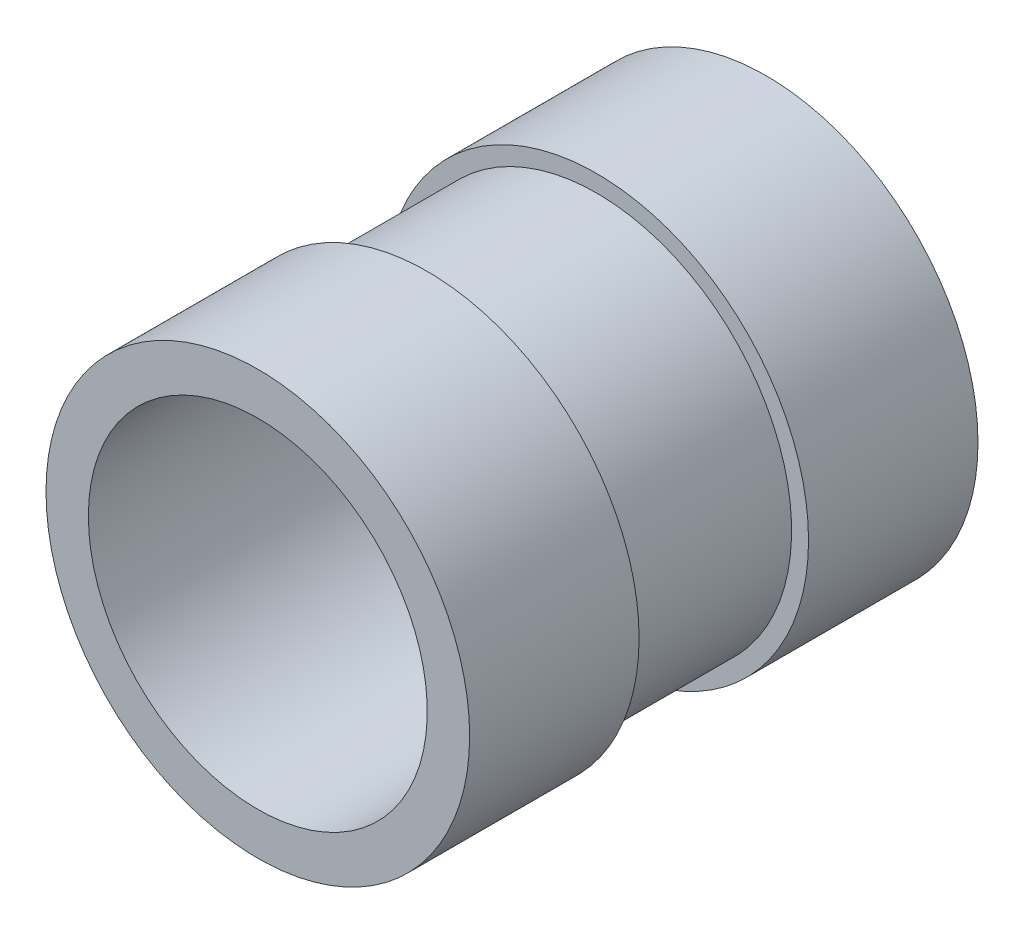
ISO-10303-21;
HEADER;
FILE_DESCRIPTION(('STEP AP214'),'2;1');
FILE_NAME('part.step','',(''),(''),'','','');
FILE_SCHEMA(('AUTOMOTIVE_DESIGN { 1 0 10303 214 1 1 1 1 }'));
ENDSEC;
DATA;
#1=APPLICATION_CONTEXT('core data for automotive mechanical design processes');
#2=APPLICATION_PROTOCOL_DEFINITION('international standard','automotive_design',2000,#1);
#3=PRODUCT_CONTEXT('',#1,'mechanical');
#4=PRODUCT('Part','Part','',(#3));
#5=PRODUCT_RELATED_PRODUCT_CATEGORY('part','',(#4));
#6=PRODUCT_DEFINITION_FORMATION('','',#4);
#7=PRODUCT_DEFINITION_CONTEXT('part definition',#1,'design');
#8=PRODUCT_DEFINITION('design','',#6,#7);
#9=PRODUCT_DEFINITION_SHAPE('','',#8);
#10=(LENGTH_UNIT() NAMED_UNIT(*) SI_UNIT(.MILLI.,.METRE.));
#11=(NAMED_UNIT(*) PLANE_ANGLE_UNIT() SI_UNIT($,.RADIAN.));
#12=(NAMED_UNIT(*) SI_UNIT($,.STERADIAN.) SOLID_ANGLE_UNIT());
#13=UNCERTAINTY_MEASURE_WITH_UNIT(LENGTH_MEASURE(1.E-05),#10,'distance_accuracy_value','');
#14=(GEOMETRIC_REPRESENTATION_CONTEXT(3) GLOBAL_UNCERTAINTY_ASSIGNED_CONTEXT((#13)) GLOBAL_UNIT_ASSIGNED_CONTEXT((#10,
#11,#12)) REPRESENTATION_CONTEXT('',''));
#15=CARTESIAN_POINT('',(0.,0.,0.));
#16=DIRECTION('',(0.,0.,1.));
#17=DIRECTION('',(1.,0.,0.));
#18=AXIS2_PLACEMENT_3D('',#15,#16,#17);
#19=CARTESIAN_POINT('',(0.,0.,0.));
#20=DIRECTION('',(0.,0.,-1.));
#21=DIRECTION('',(-1.,0.,0.));
#22=AXIS2_PLACEMENT_3D('',#19,#20,#21);
#23=PLANE('',#22);
#24=CARTESIAN_POINT('',(0.,0.,0.));
#25=DIRECTION('',(0.,0.,-1.));
#26=DIRECTION('',(-1.,0.,0.));
#27=AXIS2_PLACEMENT_3D('',#24,#25,#26);
#28=CIRCLE('',#27,2.);
#29=CARTESIAN_POINT('',(-2.,0.,0.));
#30=VERTEX_POINT('',#29);
#31=EDGE_CURVE('E60',#30,#30,#28,.T.);
#32=ORIENTED_EDGE('',*,*,#31,.T.);
#33=EDGE_LOOP('',(#32));
#34=FACE_BOUND('',#33,.T.);
#35=CARTESIAN_POINT('',(0.,0.,0.));
#36=DIRECTION('',(0.,0.,-1.));
#37=DIRECTION('',(-1.,0.,0.));
#38=AXIS2_PLACEMENT_3D('',#35,#36,#37);
#39=CIRCLE('',#38,2.5);
#40=CARTESIAN_POINT('',(-2.5,0.,0.));
#41=VERTEX_POINT('',#40);
#42=EDGE_CURVE('E10',#41,#41,#39,.T.);
#43=ORIENTED_EDGE('',*,*,#42,.F.);
#44=EDGE_LOOP('',(#43));
#45=FACE_BOUND('',#44,.T.);
#46=ADVANCED_FACE('F35',(#34,#45),#23,.F.);
#47=CARTESIAN_POINT('',(0.,0.,-11.944023292159));
#48=DIRECTION('',(0.,0.,-1.));
#49=DIRECTION('',(-1.,0.,0.));
#50=AXIS2_PLACEMENT_3D('',#47,#48,#49);
#51=CYLINDRICAL_SURFACE('',#50,2.5);
#52=CARTESIAN_POINT('',(0.,0.,-2.));
#53=DIRECTION('',(0.,0.,-1.));
#54=DIRECTION('',(-1.,0.,0.));
#55=AXIS2_PLACEMENT_3D('',#52,#53,#54);
#56=CIRCLE('',#55,2.5);
#57=CARTESIAN_POINT('',(-2.5,0.,-2.));
#58=VERTEX_POINT('',#57);
#59=EDGE_CURVE('E41',#58,#58,#56,.T.);
#60=ORIENTED_EDGE('',*,*,#59,.F.);
#61=EDGE_LOOP('',(#60));
#62=FACE_BOUND('',#61,.T.);
#63=ORIENTED_EDGE('',*,*,#42,.T.);
#64=EDGE_LOOP('',(#63));
#65=FACE_BOUND('',#64,.T.);
#66=ADVANCED_FACE('F101',(#62,#65),#51,.T.);
#67=CARTESIAN_POINT('',(2.5,0.,-2.));
#68=DIRECTION('',(0.,0.,1.));
#69=DIRECTION('',(1.,0.,0.));
#70=AXIS2_PLACEMENT_3D('',#67,#68,#69);
#71=PLANE('',#70);
#72=CARTESIAN_POINT('',(0.,0.,-2.));
#73=DIRECTION('',(0.,0.,-1.));
#74=DIRECTION('',(-1.,0.,0.));
#75=AXIS2_PLACEMENT_3D('',#72,#73,#74);
#76=CIRCLE('',#75,2.3);
#77=CARTESIAN_POINT('',(-2.3,0.,-2.));
#78=VERTEX_POINT('',#77);
#79=EDGE_CURVE('E45',#78,#78,#76,.T.);
#80=ORIENTED_EDGE('',*,*,#79,.F.);
#81=EDGE_LOOP('',(#80));
#82=FACE_BOUND('',#81,.T.);
#83=ORIENTED_EDGE('',*,*,#59,.T.);
#84=EDGE_LOOP('',(#83));
#85=FACE_BOUND('',#84,.T.);
#86=ADVANCED_FACE('F96',(#82,#85),#71,.F.);
#87=CARTESIAN_POINT('',(0.,0.,-11.944023292159));
#88=DIRECTION('',(0.,0.,-1.));
#89=DIRECTION('',(-1.,0.,0.));
#90=AXIS2_PLACEMENT_3D('',#87,#88,#89);
#91=CYLINDRICAL_SURFACE('',#90,2.3);
#92=CARTESIAN_POINT('',(0.,0.,-4.));
#93=DIRECTION('',(0.,0.,-1.));
#94=DIRECTION('',(-1.,0.,0.));
#95=AXIS2_PLACEMENT_3D('',#92,#93,#94);
#96=CIRCLE('',#95,2.3);
#97=CARTESIAN_POINT('',(-2.3,0.,-4.));
#98=VERTEX_POINT('',#97);
#99=EDGE_CURVE('E49',#98,#98,#96,.T.);
#100=ORIENTED_EDGE('',*,*,#99,.F.);
#101=EDGE_LOOP('',(#100));
#102=FACE_BOUND('',#101,.T.);
#103=ORIENTED_EDGE('',*,*,#79,.T.);
#104=EDGE_LOOP('',(#103));
#105=FACE_BOUND('',#104,.T.);
#106=ADVANCED_FACE('F90',(#102,#105),#91,.T.);
#107=CARTESIAN_POINT('',(2.3,0.,-4.));
#108=DIRECTION('',(0.,0.,-1.));
#109=DIRECTION('',(-1.,0.,0.));
#110=AXIS2_PLACEMENT_3D('',#107,#108,#109);
#111=PLANE('',#110);
#112=CARTESIAN_POINT('',(0.,0.,-4.));
#113=DIRECTION('',(0.,0.,-1.));
#114=DIRECTION('',(-1.,0.,0.));
#115=AXIS2_PLACEMENT_3D('',#112,#113,#114);
#116=CIRCLE('',#115,2.5);
#117=CARTESIAN_POINT('',(-2.5,0.,-4.));
#118=VERTEX_POINT('',#117);
#119=EDGE_CURVE('E54',#118,#118,#116,.T.);
#120=ORIENTED_EDGE('',*,*,#119,.F.);
#121=EDGE_LOOP('',(#120));
#122=FACE_BOUND('',#121,.T.);
#123=ORIENTED_EDGE('',*,*,#99,.T.);
#124=EDGE_LOOP('',(#123));
#125=FACE_BOUND('',#124,.T.);
#126=ADVANCED_FACE('F84',(#122,#125),#111,.F.);
#127=CARTESIAN_POINT('',(0.,0.,-11.944023292159));
#128=DIRECTION('',(0.,0.,-1.));
#129=DIRECTION('',(-1.,0.,0.));
#130=AXIS2_PLACEMENT_3D('',#127,#128,#129);
#131=CYLINDRICAL_SURFACE('',#130,2.5);
#132=CARTESIAN_POINT('',(0.,0.,-6.));
#133=DIRECTION('',(0.,0.,-1.));
#134=DIRECTION('',(-1.,0.,0.));
#135=AXIS2_PLACEMENT_3D('',#132,#133,#134);
#136=CIRCLE('',#135,2.5);
#137=CARTESIAN_POINT('',(-2.5,0.,-6.));
#138=VERTEX_POINT('',#137);
#139=EDGE_CURVE('E57',#138,#138,#136,.T.);
#140=ORIENTED_EDGE('',*,*,#139,.F.);
#141=EDGE_LOOP('',(#140));
#142=FACE_BOUND('',#141,.T.);
#143=ORIENTED_EDGE('',*,*,#119,.T.);
#144=EDGE_LOOP('',(#143));
#145=FACE_BOUND('',#144,.T.);
#146=ADVANCED_FACE('F78',(#142,#145),#131,.T.);
#147=CARTESIAN_POINT('',(2.5,0.,-6.));
#148=DIRECTION('',(0.,0.,1.));
#149=DIRECTION('',(1.,0.,0.));
#150=AXIS2_PLACEMENT_3D('',#147,#148,#149);
#151=PLANE('',#150);
#152=CARTESIAN_POINT('',(0.,0.,-6.));
#153=DIRECTION('',(0.,0.,-1.));
#154=DIRECTION('',(-1.,0.,0.));
#155=AXIS2_PLACEMENT_3D('',#152,#153,#154);
#156=CIRCLE('',#155,2.);
#157=CARTESIAN_POINT('',(-2.,0.,-6.));
#158=VERTEX_POINT('',#157);
#159=EDGE_CURVE('E61',#158,#158,#156,.T.);
#160=ORIENTED_EDGE('',*,*,#159,.F.);
#161=EDGE_LOOP('',(#160));
#162=FACE_BOUND('',#161,.T.);
#163=ORIENTED_EDGE('',*,*,#139,.T.);
#164=EDGE_LOOP('',(#163));
#165=FACE_BOUND('',#164,.T.);
#166=ADVANCED_FACE('F72',(#162,#165),#151,.F.);
#167=CARTESIAN_POINT('',(0.,0.,0.));
#168=DIRECTION('',(0.,0.,-1.));
#169=DIRECTION('',(-1.,0.,0.));
#170=AXIS2_PLACEMENT_3D('',#167,#168,#169);
#171=CYLINDRICAL_SURFACE('',#170,2.);
#172=ORIENTED_EDGE('',*,*,#31,.F.);
#173=EDGE_LOOP('',(#172));
#174=FACE_BOUND('',#173,.T.);
#175=ORIENTED_EDGE('',*,*,#159,.T.);
#176=EDGE_LOOP('',(#175));
#177=FACE_BOUND('',#176,.T.);
#178=ADVANCED_FACE('F69',(#174,#177),#171,.F.);
#179=CLOSED_SHELL('',(#46,#66,#86,#106,#126,#146,#166,#178));
#180=MANIFOLD_SOLID_BREP('B2',#179);
#181=ADVANCED_BREP_SHAPE_REPRESENTATION('',(#18,#180),#14);
#182=SHAPE_DEFINITION_REPRESENTATION(#9,#181);
ENDSEC;
END-ISO-10303-21;
